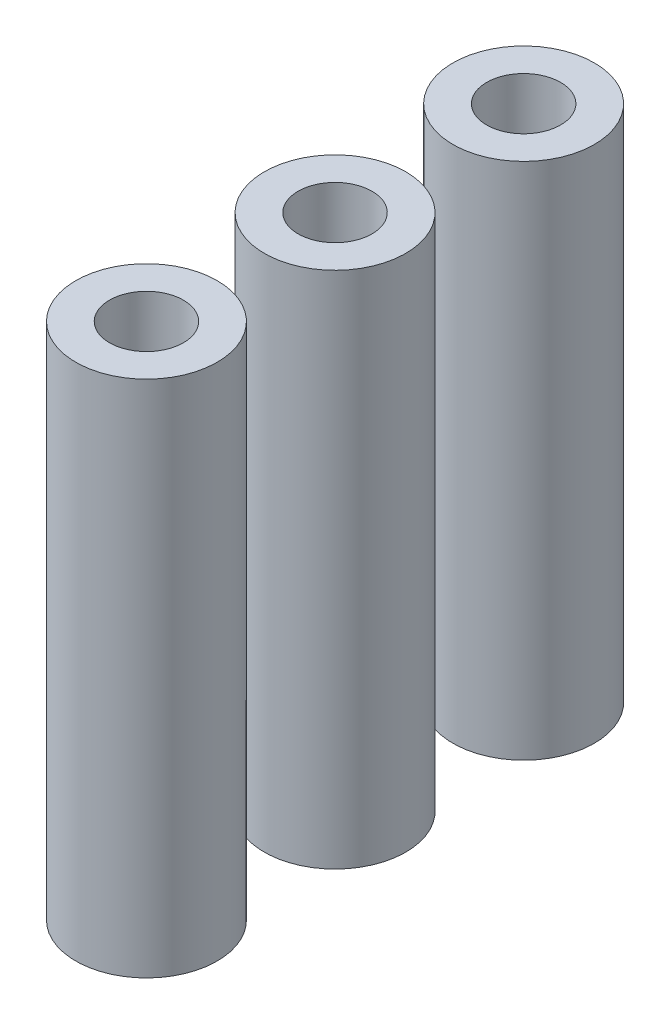
ISO-10303-21;
HEADER;
FILE_DESCRIPTION(('STEP AP214'),'2;1');
FILE_NAME('part.step','',(''),(''),'','','');
FILE_SCHEMA(('AUTOMOTIVE_DESIGN { 1 0 10303 214 1 1 1 1 }'));
ENDSEC;
DATA;
#1=APPLICATION_CONTEXT('core data for automotive mechanical design processes');
#2=APPLICATION_PROTOCOL_DEFINITION('international standard','automotive_design',2000,#1);
#3=PRODUCT_CONTEXT('',#1,'mechanical');
#4=PRODUCT('Part','Part','',(#3));
#5=PRODUCT_RELATED_PRODUCT_CATEGORY('part','',(#4));
#6=PRODUCT_DEFINITION_FORMATION('','',#4);
#7=PRODUCT_DEFINITION_CONTEXT('part definition',#1,'design');
#8=PRODUCT_DEFINITION('design','',#6,#7);
#9=PRODUCT_DEFINITION_SHAPE('','',#8);
#10=(LENGTH_UNIT() NAMED_UNIT(*) SI_UNIT(.MILLI.,.METRE.));
#11=(NAMED_UNIT(*) PLANE_ANGLE_UNIT() SI_UNIT($,.RADIAN.));
#12=(NAMED_UNIT(*) SI_UNIT($,.STERADIAN.) SOLID_ANGLE_UNIT());
#13=UNCERTAINTY_MEASURE_WITH_UNIT(LENGTH_MEASURE(1.E-05),#10,'distance_accuracy_value','');
#14=(GEOMETRIC_REPRESENTATION_CONTEXT(3) GLOBAL_UNCERTAINTY_ASSIGNED_CONTEXT((#13)) GLOBAL_UNIT_ASSIGNED_CONTEXT((#10,
#11,#12)) REPRESENTATION_CONTEXT('',''));
#15=CARTESIAN_POINT('',(0.,0.,0.));
#16=DIRECTION('',(0.,0.,1.));
#17=DIRECTION('',(1.,0.,0.));
#18=AXIS2_PLACEMENT_3D('',#15,#16,#17);
#19=CARTESIAN_POINT('',(76.2,-85.725,139.7));
#20=DIRECTION('',(0.,1.,0.));
#21=DIRECTION('',(0.,0.,1.));
#22=AXIS2_PLACEMENT_3D('',#19,#20,#21);
#23=CYLINDRICAL_SURFACE('',#22,2.4892);
#24=CARTESIAN_POINT('',(76.2,-85.725,139.7));
#25=DIRECTION('',(0.,-1.,0.));
#26=DIRECTION('',(0.,0.,-1.));
#27=AXIS2_PLACEMENT_3D('',#24,#25,#26);
#28=CIRCLE('',#27,2.4892);
#29=CARTESIAN_POINT('',(76.2,-85.725,137.2108));
#30=VERTEX_POINT('',#29);
#31=EDGE_CURVE('P0_E22',#30,#30,#28,.T.);
#32=ORIENTED_EDGE('',*,*,#31,.T.);
#33=EDGE_LOOP('',(#32));
#34=FACE_BOUND('',#33,.T.);
#35=CARTESIAN_POINT('',(76.2,-50.8,139.7));
#36=DIRECTION('',(0.,-1.,0.));
#37=DIRECTION('',(0.,0.,-1.));
#38=AXIS2_PLACEMENT_3D('',#35,#36,#37);
#39=CIRCLE('',#38,2.4892);
#40=CARTESIAN_POINT('',(76.2,-50.8,137.2108));
#41=VERTEX_POINT('',#40);
#42=EDGE_CURVE('P0_E28',#41,#41,#39,.T.);
#43=ORIENTED_EDGE('',*,*,#42,.F.);
#44=EDGE_LOOP('',(#43));
#45=FACE_BOUND('',#44,.T.);
#46=ADVANCED_FACE('P0_F15',(#34,#45),#23,.F.);
#47=CARTESIAN_POINT('',(76.2,-85.725,139.7));
#48=DIRECTION('',(0.,1.,0.));
#49=DIRECTION('',(0.,0.,1.));
#50=AXIS2_PLACEMENT_3D('',#47,#48,#49);
#51=CYLINDRICAL_SURFACE('',#50,4.7625);
#52=CARTESIAN_POINT('',(76.2,-85.725,139.7));
#53=DIRECTION('',(0.,-1.,0.));
#54=DIRECTION('',(0.,0.,-1.));
#55=AXIS2_PLACEMENT_3D('',#52,#53,#54);
#56=CIRCLE('',#55,4.7625);
#57=CARTESIAN_POINT('',(76.2,-85.725,134.9375));
#58=VERTEX_POINT('',#57);
#59=EDGE_CURVE('P0_E10',#58,#58,#56,.T.);
#60=ORIENTED_EDGE('',*,*,#59,.F.);
#61=EDGE_LOOP('',(#60));
#62=FACE_BOUND('',#61,.T.);
#63=CARTESIAN_POINT('',(76.2,-50.8,139.7));
#64=DIRECTION('',(0.,-1.,0.));
#65=DIRECTION('',(0.,0.,-1.));
#66=AXIS2_PLACEMENT_3D('',#63,#64,#65);
#67=CIRCLE('',#66,4.7625);
#68=CARTESIAN_POINT('',(76.2,-50.8,134.9375));
#69=VERTEX_POINT('',#68);
#70=EDGE_CURVE('P0_E18',#69,#69,#67,.T.);
#71=ORIENTED_EDGE('',*,*,#70,.T.);
#72=EDGE_LOOP('',(#71));
#73=FACE_BOUND('',#72,.T.);
#74=ADVANCED_FACE('P0_F35',(#62,#73),#51,.T.);
#75=CARTESIAN_POINT('',(76.2,-85.725,114.3));
#76=DIRECTION('',(0.,-1.,0.));
#77=DIRECTION('',(1.,0.,0.));
#78=AXIS2_PLACEMENT_3D('',#75,#76,#77);
#79=PLANE('',#78);
#80=ORIENTED_EDGE('',*,*,#31,.F.);
#81=EDGE_LOOP('',(#80));
#82=FACE_BOUND('',#81,.T.);
#83=ORIENTED_EDGE('',*,*,#59,.T.);
#84=EDGE_LOOP('',(#83));
#85=FACE_BOUND('',#84,.T.);
#86=ADVANCED_FACE('P0_F39',(#82,#85),#79,.T.);
#87=CARTESIAN_POINT('',(76.2,-50.8,114.3));
#88=DIRECTION('',(0.,-1.,0.));
#89=DIRECTION('',(1.,0.,0.));
#90=AXIS2_PLACEMENT_3D('',#87,#88,#89);
#91=PLANE('',#90);
#92=ORIENTED_EDGE('',*,*,#42,.T.);
#93=EDGE_LOOP('',(#92));
#94=FACE_BOUND('',#93,.T.);
#95=ORIENTED_EDGE('',*,*,#70,.F.);
#96=EDGE_LOOP('',(#95));
#97=FACE_BOUND('',#96,.T.);
#98=ADVANCED_FACE('P0_F37',(#94,#97),#91,.F.);
#99=CLOSED_SHELL('',(#46,#74,#86,#98));
#100=MANIFOLD_SOLID_BREP('P0_B1',#99);
#101=CARTESIAN_POINT('',(76.2,-85.725,165.1));
#102=DIRECTION('',(0.,1.,0.));
#103=DIRECTION('',(0.,0.,1.));
#104=AXIS2_PLACEMENT_3D('',#101,#102,#103);
#105=CYLINDRICAL_SURFACE('',#104,2.4892);
#106=CARTESIAN_POINT('',(76.2,-85.725,165.1));
#107=DIRECTION('',(0.,-1.,0.));
#108=DIRECTION('',(0.,0.,-1.));
#109=AXIS2_PLACEMENT_3D('',#106,#107,#108);
#110=CIRCLE('',#109,2.4892);
#111=CARTESIAN_POINT('',(76.2,-85.725,162.6108));
#112=VERTEX_POINT('',#111);
#113=EDGE_CURVE('P1_E22',#112,#112,#110,.T.);
#114=ORIENTED_EDGE('',*,*,#113,.T.);
#115=EDGE_LOOP('',(#114));
#116=FACE_BOUND('',#115,.T.);
#117=CARTESIAN_POINT('',(76.2,-50.8,165.1));
#118=DIRECTION('',(0.,-1.,0.));
#119=DIRECTION('',(0.,0.,-1.));
#120=AXIS2_PLACEMENT_3D('',#117,#118,#119);
#121=CIRCLE('',#120,2.4892);
#122=CARTESIAN_POINT('',(76.2,-50.8,162.6108));
#123=VERTEX_POINT('',#122);
#124=EDGE_CURVE('P1_E28',#123,#123,#121,.T.);
#125=ORIENTED_EDGE('',*,*,#124,.F.);
#126=EDGE_LOOP('',(#125));
#127=FACE_BOUND('',#126,.T.);
#128=ADVANCED_FACE('P1_F15',(#116,#127),#105,.F.);
#129=CARTESIAN_POINT('',(76.2,-85.725,165.1));
#130=DIRECTION('',(0.,1.,0.));
#131=DIRECTION('',(0.,0.,1.));
#132=AXIS2_PLACEMENT_3D('',#129,#130,#131);
#133=CYLINDRICAL_SURFACE('',#132,4.7625);
#134=CARTESIAN_POINT('',(76.2,-85.725,165.1));
#135=DIRECTION('',(0.,-1.,0.));
#136=DIRECTION('',(0.,0.,-1.));
#137=AXIS2_PLACEMENT_3D('',#134,#135,#136);
#138=CIRCLE('',#137,4.7625);
#139=CARTESIAN_POINT('',(76.2,-85.725,160.3375));
#140=VERTEX_POINT('',#139);
#141=EDGE_CURVE('P1_E10',#140,#140,#138,.T.);
#142=ORIENTED_EDGE('',*,*,#141,.F.);
#143=EDGE_LOOP('',(#142));
#144=FACE_BOUND('',#143,.T.);
#145=CARTESIAN_POINT('',(76.2,-50.8,165.1));
#146=DIRECTION('',(0.,-1.,0.));
#147=DIRECTION('',(0.,0.,-1.));
#148=AXIS2_PLACEMENT_3D('',#145,#146,#147);
#149=CIRCLE('',#148,4.7625);
#150=CARTESIAN_POINT('',(76.2,-50.8,160.3375));
#151=VERTEX_POINT('',#150);
#152=EDGE_CURVE('P1_E18',#151,#151,#149,.T.);
#153=ORIENTED_EDGE('',*,*,#152,.T.);
#154=EDGE_LOOP('',(#153));
#155=FACE_BOUND('',#154,.T.);
#156=ADVANCED_FACE('P1_F35',(#144,#155),#133,.T.);
#157=CARTESIAN_POINT('',(76.2,-85.725,139.7));
#158=DIRECTION('',(0.,-1.,0.));
#159=DIRECTION('',(1.,0.,0.));
#160=AXIS2_PLACEMENT_3D('',#157,#158,#159);
#161=PLANE('',#160);
#162=ORIENTED_EDGE('',*,*,#113,.F.);
#163=EDGE_LOOP('',(#162));
#164=FACE_BOUND('',#163,.T.);
#165=ORIENTED_EDGE('',*,*,#141,.T.);
#166=EDGE_LOOP('',(#165));
#167=FACE_BOUND('',#166,.T.);
#168=ADVANCED_FACE('P1_F39',(#164,#167),#161,.T.);
#169=CARTESIAN_POINT('',(76.2,-50.8,139.7));
#170=DIRECTION('',(0.,-1.,0.));
#171=DIRECTION('',(1.,0.,0.));
#172=AXIS2_PLACEMENT_3D('',#169,#170,#171);
#173=PLANE('',#172);
#174=ORIENTED_EDGE('',*,*,#124,.T.);
#175=EDGE_LOOP('',(#174));
#176=FACE_BOUND('',#175,.T.);
#177=ORIENTED_EDGE('',*,*,#152,.F.);
#178=EDGE_LOOP('',(#177));
#179=FACE_BOUND('',#178,.T.);
#180=ADVANCED_FACE('P1_F37',(#176,#179),#173,.F.);
#181=CLOSED_SHELL('',(#128,#156,#168,#180));
#182=MANIFOLD_SOLID_BREP('P1_B1',#181);
#183=CARTESIAN_POINT('',(76.2,-85.725,152.4));
#184=DIRECTION('',(0.,1.,0.));
#185=DIRECTION('',(0.,0.,1.));
#186=AXIS2_PLACEMENT_3D('',#183,#184,#185);
#187=CYLINDRICAL_SURFACE('',#186,2.4892);
#188=CARTESIAN_POINT('',(76.2,-85.725,152.4));
#189=DIRECTION('',(0.,-1.,0.));
#190=DIRECTION('',(0.,0.,-1.));
#191=AXIS2_PLACEMENT_3D('',#188,#189,#190);
#192=CIRCLE('',#191,2.4892);
#193=CARTESIAN_POINT('',(76.2,-85.725,149.9108));
#194=VERTEX_POINT('',#193);
#195=EDGE_CURVE('P2_E22',#194,#194,#192,.T.);
#196=ORIENTED_EDGE('',*,*,#195,.T.);
#197=EDGE_LOOP('',(#196));
#198=FACE_BOUND('',#197,.T.);
#199=CARTESIAN_POINT('',(76.2,-50.8,152.4));
#200=DIRECTION('',(0.,-1.,0.));
#201=DIRECTION('',(0.,0.,-1.));
#202=AXIS2_PLACEMENT_3D('',#199,#200,#201);
#203=CIRCLE('',#202,2.4892);
#204=CARTESIAN_POINT('',(76.2,-50.8,149.9108));
#205=VERTEX_POINT('',#204);
#206=EDGE_CURVE('P2_E28',#205,#205,#203,.T.);
#207=ORIENTED_EDGE('',*,*,#206,.F.);
#208=EDGE_LOOP('',(#207));
#209=FACE_BOUND('',#208,.T.);
#210=ADVANCED_FACE('P2_F15',(#198,#209),#187,.F.);
#211=CARTESIAN_POINT('',(76.2,-85.725,152.4));
#212=DIRECTION('',(0.,1.,0.));
#213=DIRECTION('',(0.,0.,1.));
#214=AXIS2_PLACEMENT_3D('',#211,#212,#213);
#215=CYLINDRICAL_SURFACE('',#214,4.7625);
#216=CARTESIAN_POINT('',(76.2,-85.725,152.4));
#217=DIRECTION('',(0.,-1.,0.));
#218=DIRECTION('',(0.,0.,-1.));
#219=AXIS2_PLACEMENT_3D('',#216,#217,#218);
#220=CIRCLE('',#219,4.7625);
#221=CARTESIAN_POINT('',(76.2,-85.725,147.6375));
#222=VERTEX_POINT('',#221);
#223=EDGE_CURVE('P2_E10',#222,#222,#220,.T.);
#224=ORIENTED_EDGE('',*,*,#223,.F.);
#225=EDGE_LOOP('',(#224));
#226=FACE_BOUND('',#225,.T.);
#227=CARTESIAN_POINT('',(76.2,-50.8,152.4));
#228=DIRECTION('',(0.,-1.,0.));
#229=DIRECTION('',(0.,0.,-1.));
#230=AXIS2_PLACEMENT_3D('',#227,#228,#229);
#231=CIRCLE('',#230,4.7625);
#232=CARTESIAN_POINT('',(76.2,-50.8,147.6375));
#233=VERTEX_POINT('',#232);
#234=EDGE_CURVE('P2_E18',#233,#233,#231,.T.);
#235=ORIENTED_EDGE('',*,*,#234,.T.);
#236=EDGE_LOOP('',(#235));
#237=FACE_BOUND('',#236,.T.);
#238=ADVANCED_FACE('P2_F35',(#226,#237),#215,.T.);
#239=CARTESIAN_POINT('',(76.2,-85.725,127.));
#240=DIRECTION('',(0.,-1.,0.));
#241=DIRECTION('',(1.,0.,0.));
#242=AXIS2_PLACEMENT_3D('',#239,#240,#241);
#243=PLANE('',#242);
#244=ORIENTED_EDGE('',*,*,#195,.F.);
#245=EDGE_LOOP('',(#244));
#246=FACE_BOUND('',#245,.T.);
#247=ORIENTED_EDGE('',*,*,#223,.T.);
#248=EDGE_LOOP('',(#247));
#249=FACE_BOUND('',#248,.T.);
#250=ADVANCED_FACE('P2_F39',(#246,#249),#243,.T.);
#251=CARTESIAN_POINT('',(76.2,-50.8,127.));
#252=DIRECTION('',(0.,-1.,0.));
#253=DIRECTION('',(1.,0.,0.));
#254=AXIS2_PLACEMENT_3D('',#251,#252,#253);
#255=PLANE('',#254);
#256=ORIENTED_EDGE('',*,*,#206,.T.);
#257=EDGE_LOOP('',(#256));
#258=FACE_BOUND('',#257,.T.);
#259=ORIENTED_EDGE('',*,*,#234,.F.);
#260=EDGE_LOOP('',(#259));
#261=FACE_BOUND('',#260,.T.);
#262=ADVANCED_FACE('P2_F37',(#258,#261),#255,.F.);
#263=CLOSED_SHELL('',(#210,#238,#250,#262));
#264=MANIFOLD_SOLID_BREP('P2_B1',#263);
#265=ADVANCED_BREP_SHAPE_REPRESENTATION('',(#18,#100,#182,#264),#14);
#266=SHAPE_DEFINITION_REPRESENTATION(#9,#265);
ENDSEC;
END-ISO-10303-21;
